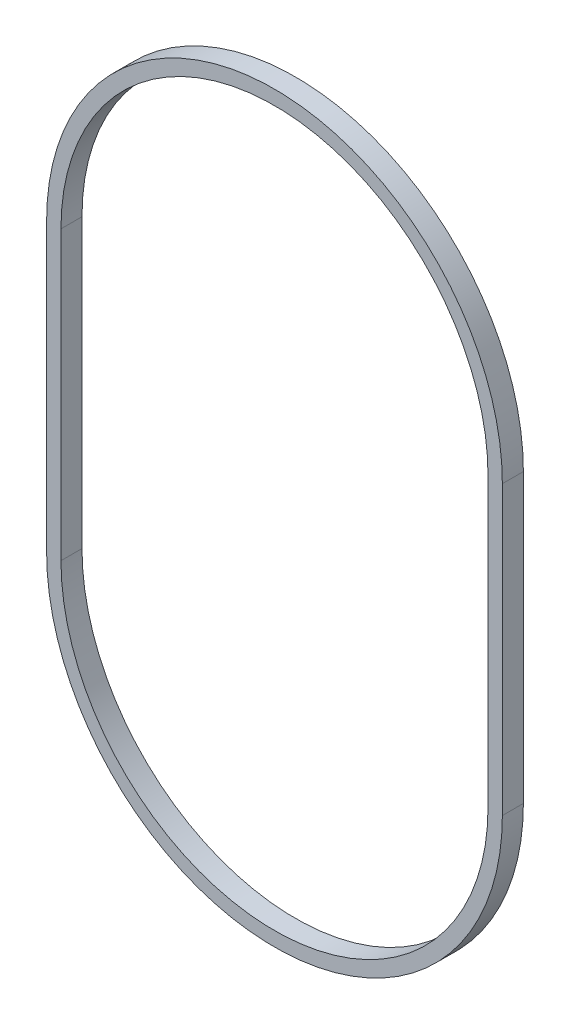
ISO-10303-21;
HEADER;
FILE_DESCRIPTION(('STEP AP214'),'2;1');
FILE_NAME('part.step','',(''),(''),'','','');
FILE_SCHEMA(('AUTOMOTIVE_DESIGN { 1 0 10303 214 1 1 1 1 }'));
ENDSEC;
DATA;
#1=APPLICATION_CONTEXT('core data for automotive mechanical design processes');
#2=APPLICATION_PROTOCOL_DEFINITION('international standard','automotive_design',2000,#1);
#3=PRODUCT_CONTEXT('',#1,'mechanical');
#4=PRODUCT('Part','Part','',(#3));
#5=PRODUCT_RELATED_PRODUCT_CATEGORY('part','',(#4));
#6=PRODUCT_DEFINITION_FORMATION('','',#4);
#7=PRODUCT_DEFINITION_CONTEXT('part definition',#1,'design');
#8=PRODUCT_DEFINITION('design','',#6,#7);
#9=PRODUCT_DEFINITION_SHAPE('','',#8);
#10=(LENGTH_UNIT() NAMED_UNIT(*) SI_UNIT(.MILLI.,.METRE.));
#11=(NAMED_UNIT(*) PLANE_ANGLE_UNIT() SI_UNIT($,.RADIAN.));
#12=(NAMED_UNIT(*) SI_UNIT($,.STERADIAN.) SOLID_ANGLE_UNIT());
#13=UNCERTAINTY_MEASURE_WITH_UNIT(LENGTH_MEASURE(1.E-05),#10,'distance_accuracy_value','');
#14=(GEOMETRIC_REPRESENTATION_CONTEXT(3) GLOBAL_UNCERTAINTY_ASSIGNED_CONTEXT((#13)) GLOBAL_UNIT_ASSIGNED_CONTEXT((#10,
#11,#12)) REPRESENTATION_CONTEXT('',''));
#15=CARTESIAN_POINT('',(0.,0.,0.));
#16=DIRECTION('',(0.,0.,1.));
#17=DIRECTION('',(1.,0.,0.));
#18=AXIS2_PLACEMENT_3D('',#15,#16,#17);
#19=CARTESIAN_POINT('',(0.,-15.04,2.2));
#20=DIRECTION('',(0.,0.,1.));
#21=DIRECTION('',(1.,0.,0.));
#22=AXIS2_PLACEMENT_3D('',#19,#20,#21);
#23=PLANE('',#22);
#24=CARTESIAN_POINT('',(0.,-15.04,2.2));
#25=DIRECTION('',(0.,0.,1.));
#26=DIRECTION('',(1.,0.,0.));
#27=AXIS2_PLACEMENT_3D('',#24,#25,#26);
#28=CIRCLE('',#27,23.85);
#29=CARTESIAN_POINT('',(-23.85,-15.04,2.2));
#30=VERTEX_POINT('',#29);
#31=CARTESIAN_POINT('',(23.85,-15.04,2.2));
#32=VERTEX_POINT('',#31);
#33=EDGE_CURVE('E134',#30,#32,#28,.T.);
#34=ORIENTED_EDGE('',*,*,#33,.T.);
#35=DIRECTION('',(0.,1.,0.));
#36=VECTOR('',#35,1.);
#37=CARTESIAN_POINT('',(23.85,-15.04,2.2));
#38=LINE('',#37,#36);
#39=CARTESIAN_POINT('',(23.85,15.04,2.2));
#40=VERTEX_POINT('',#39);
#41=EDGE_CURVE('E137',#32,#40,#38,.T.);
#42=ORIENTED_EDGE('',*,*,#41,.T.);
#43=CARTESIAN_POINT('',(0.,15.04,2.2));
#44=DIRECTION('',(0.,0.,1.));
#45=DIRECTION('',(1.,0.,0.));
#46=AXIS2_PLACEMENT_3D('',#43,#44,#45);
#47=CIRCLE('',#46,23.85);
#48=CARTESIAN_POINT('',(-23.85,15.04,2.2));
#49=VERTEX_POINT('',#48);
#50=EDGE_CURVE('E140',#40,#49,#47,.T.);
#51=ORIENTED_EDGE('',*,*,#50,.T.);
#52=DIRECTION('',(0.,-1.,0.));
#53=VECTOR('',#52,1.);
#54=CARTESIAN_POINT('',(-23.85,-15.04,2.2));
#55=LINE('',#54,#53);
#56=EDGE_CURVE('E142',#49,#30,#55,.T.);
#57=ORIENTED_EDGE('',*,*,#56,.T.);
#58=EDGE_LOOP('',(#34,#42,#51,#57));
#59=FACE_BOUND('',#58,.T.);
#60=DIRECTION('',(0.,1.,0.));
#61=VECTOR('',#60,1.);
#62=CARTESIAN_POINT('',(22.35,-15.04,2.2));
#63=LINE('',#62,#61);
#64=CARTESIAN_POINT('',(22.35,-15.04,2.2));
#65=VERTEX_POINT('',#64);
#66=CARTESIAN_POINT('',(22.35,15.04,2.2));
#67=VERTEX_POINT('',#66);
#68=EDGE_CURVE('E106',#65,#67,#63,.T.);
#69=ORIENTED_EDGE('',*,*,#68,.F.);
#70=CARTESIAN_POINT('',(0.,-15.04,2.2));
#71=DIRECTION('',(0.,0.,1.));
#72=DIRECTION('',(1.,0.,0.));
#73=AXIS2_PLACEMENT_3D('',#70,#71,#72);
#74=CIRCLE('',#73,22.35);
#75=CARTESIAN_POINT('',(-22.35,-15.04,2.2));
#76=VERTEX_POINT('',#75);
#77=EDGE_CURVE('E98',#76,#65,#74,.T.);
#78=ORIENTED_EDGE('',*,*,#77,.F.);
#79=DIRECTION('',(0.,-1.,0.));
#80=VECTOR('',#79,1.);
#81=CARTESIAN_POINT('',(-22.35,-15.04,2.2));
#82=LINE('',#81,#80);
#83=CARTESIAN_POINT('',(-22.35,15.04,2.2));
#84=VERTEX_POINT('',#83);
#85=EDGE_CURVE('E120',#84,#76,#82,.T.);
#86=ORIENTED_EDGE('',*,*,#85,.F.);
#87=CARTESIAN_POINT('',(0.,15.04,2.2));
#88=DIRECTION('',(0.,0.,1.));
#89=DIRECTION('',(1.,0.,0.));
#90=AXIS2_PLACEMENT_3D('',#87,#88,#89);
#91=CIRCLE('',#90,22.35);
#92=EDGE_CURVE('E118',#67,#84,#91,.T.);
#93=ORIENTED_EDGE('',*,*,#92,.F.);
#94=EDGE_LOOP('',(#69,#78,#86,#93));
#95=FACE_BOUND('',#94,.T.);
#96=ADVANCED_FACE('F33',(#59,#95),#23,.T.);
#97=CARTESIAN_POINT('',(0.,-15.04,0.));
#98=DIRECTION('',(0.,0.,1.));
#99=DIRECTION('',(1.,0.,0.));
#100=AXIS2_PLACEMENT_3D('',#97,#98,#99);
#101=PLANE('',#100);
#102=CARTESIAN_POINT('',(0.,-15.04,0.));
#103=DIRECTION('',(0.,0.,1.));
#104=DIRECTION('',(1.,0.,0.));
#105=AXIS2_PLACEMENT_3D('',#102,#103,#104);
#106=CIRCLE('',#105,23.85);
#107=CARTESIAN_POINT('',(-23.85,-15.04,0.));
#108=VERTEX_POINT('',#107);
#109=CARTESIAN_POINT('',(23.85,-15.04,0.));
#110=VERTEX_POINT('',#109);
#111=EDGE_CURVE('E114',#108,#110,#106,.T.);
#112=ORIENTED_EDGE('',*,*,#111,.F.);
#113=DIRECTION('',(0.,-1.,0.));
#114=VECTOR('',#113,1.);
#115=CARTESIAN_POINT('',(-23.85,-15.04,0.));
#116=LINE('',#115,#114);
#117=CARTESIAN_POINT('',(-23.85,15.04,0.));
#118=VERTEX_POINT('',#117);
#119=EDGE_CURVE('E138',#118,#108,#116,.T.);
#120=ORIENTED_EDGE('',*,*,#119,.F.);
#121=CARTESIAN_POINT('',(0.,15.04,0.));
#122=DIRECTION('',(0.,0.,1.));
#123=DIRECTION('',(1.,0.,0.));
#124=AXIS2_PLACEMENT_3D('',#121,#122,#123);
#125=CIRCLE('',#124,23.85);
#126=CARTESIAN_POINT('',(23.85,15.04,0.));
#127=VERTEX_POINT('',#126);
#128=EDGE_CURVE('E149',#127,#118,#125,.T.);
#129=ORIENTED_EDGE('',*,*,#128,.F.);
#130=DIRECTION('',(0.,1.,0.));
#131=VECTOR('',#130,1.);
#132=CARTESIAN_POINT('',(23.85,-15.04,0.));
#133=LINE('',#132,#131);
#134=EDGE_CURVE('E147',#110,#127,#133,.T.);
#135=ORIENTED_EDGE('',*,*,#134,.F.);
#136=EDGE_LOOP('',(#112,#120,#129,#135));
#137=FACE_BOUND('',#136,.T.);
#138=CARTESIAN_POINT('',(0.,-15.04,0.));
#139=DIRECTION('',(0.,0.,1.));
#140=DIRECTION('',(1.,0.,0.));
#141=AXIS2_PLACEMENT_3D('',#138,#139,#140);
#142=CIRCLE('',#141,22.35);
#143=CARTESIAN_POINT('',(-22.35,-15.04,0.));
#144=VERTEX_POINT('',#143);
#145=CARTESIAN_POINT('',(22.35,-15.04,0.));
#146=VERTEX_POINT('',#145);
#147=EDGE_CURVE('E56',#144,#146,#142,.T.);
#148=ORIENTED_EDGE('',*,*,#147,.T.);
#149=DIRECTION('',(0.,1.,0.));
#150=VECTOR('',#149,1.);
#151=CARTESIAN_POINT('',(22.35,-15.04,0.));
#152=LINE('',#151,#150);
#153=CARTESIAN_POINT('',(22.35,15.04,0.));
#154=VERTEX_POINT('',#153);
#155=EDGE_CURVE('E113',#146,#154,#152,.T.);
#156=ORIENTED_EDGE('',*,*,#155,.T.);
#157=CARTESIAN_POINT('',(0.,15.04,0.));
#158=DIRECTION('',(0.,0.,1.));
#159=DIRECTION('',(1.,0.,0.));
#160=AXIS2_PLACEMENT_3D('',#157,#158,#159);
#161=CIRCLE('',#160,22.35);
#162=CARTESIAN_POINT('',(-22.35,15.04,0.));
#163=VERTEX_POINT('',#162);
#164=EDGE_CURVE('E126',#154,#163,#161,.T.);
#165=ORIENTED_EDGE('',*,*,#164,.T.);
#166=DIRECTION('',(0.,-1.,0.));
#167=VECTOR('',#166,1.);
#168=CARTESIAN_POINT('',(-22.35,-15.04,0.));
#169=LINE('',#168,#167);
#170=EDGE_CURVE('E107',#163,#144,#169,.T.);
#171=ORIENTED_EDGE('',*,*,#170,.T.);
#172=EDGE_LOOP('',(#148,#156,#165,#171));
#173=FACE_BOUND('',#172,.T.);
#174=ADVANCED_FACE('F167',(#137,#173),#101,.F.);
#175=CARTESIAN_POINT('',(0.,-15.04,2.2));
#176=DIRECTION('',(0.,0.,-1.));
#177=DIRECTION('',(-1.,0.,0.));
#178=AXIS2_PLACEMENT_3D('',#175,#176,#177);
#179=CYLINDRICAL_SURFACE('',#178,23.85);
#180=ORIENTED_EDGE('',*,*,#111,.T.);
#181=DIRECTION('',(0.,0.,-1.));
#182=VECTOR('',#181,1.);
#183=CARTESIAN_POINT('',(23.85,-15.04,2.2));
#184=LINE('',#183,#182);
#185=EDGE_CURVE('E11',#32,#110,#184,.T.);
#186=ORIENTED_EDGE('',*,*,#185,.F.);
#187=ORIENTED_EDGE('',*,*,#33,.F.);
#188=DIRECTION('',(0.,0.,-1.));
#189=VECTOR('',#188,1.);
#190=CARTESIAN_POINT('',(-23.85,-15.04,2.2));
#191=LINE('',#190,#189);
#192=EDGE_CURVE('E144',#30,#108,#191,.T.);
#193=ORIENTED_EDGE('',*,*,#192,.T.);
#194=EDGE_LOOP('',(#180,#186,#187,#193));
#195=FACE_BOUND('',#194,.T.);
#196=ADVANCED_FACE('F35',(#195),#179,.T.);
#197=CARTESIAN_POINT('',(23.85,-15.04,2.2));
#198=DIRECTION('',(-1.,0.,0.));
#199=DIRECTION('',(0.,0.,1.));
#200=AXIS2_PLACEMENT_3D('',#197,#198,#199);
#201=PLANE('',#200);
#202=ORIENTED_EDGE('',*,*,#134,.T.);
#203=DIRECTION('',(0.,0.,-1.));
#204=VECTOR('',#203,1.);
#205=CARTESIAN_POINT('',(23.85,15.04,2.2));
#206=LINE('',#205,#204);
#207=EDGE_CURVE('E41',#40,#127,#206,.T.);
#208=ORIENTED_EDGE('',*,*,#207,.F.);
#209=ORIENTED_EDGE('',*,*,#41,.F.);
#210=ORIENTED_EDGE('',*,*,#185,.T.);
#211=EDGE_LOOP('',(#202,#208,#209,#210));
#212=FACE_BOUND('',#211,.T.);
#213=ADVANCED_FACE('F177',(#212),#201,.F.);
#214=CARTESIAN_POINT('',(0.,15.04,2.2));
#215=DIRECTION('',(0.,0.,-1.));
#216=DIRECTION('',(-1.,0.,0.));
#217=AXIS2_PLACEMENT_3D('',#214,#215,#216);
#218=CYLINDRICAL_SURFACE('',#217,23.85);
#219=ORIENTED_EDGE('',*,*,#128,.T.);
#220=DIRECTION('',(0.,0.,-1.));
#221=VECTOR('',#220,1.);
#222=CARTESIAN_POINT('',(-23.85,15.04,2.2));
#223=LINE('',#222,#221);
#224=EDGE_CURVE('E154',#49,#118,#223,.T.);
#225=ORIENTED_EDGE('',*,*,#224,.F.);
#226=ORIENTED_EDGE('',*,*,#50,.F.);
#227=ORIENTED_EDGE('',*,*,#207,.T.);
#228=EDGE_LOOP('',(#219,#225,#226,#227));
#229=FACE_BOUND('',#228,.T.);
#230=ADVANCED_FACE('F161',(#229),#218,.T.);
#231=CARTESIAN_POINT('',(-23.85,-15.04,2.2));
#232=DIRECTION('',(1.,0.,0.));
#233=DIRECTION('',(0.,0.,-1.));
#234=AXIS2_PLACEMENT_3D('',#231,#232,#233);
#235=PLANE('',#234);
#236=ORIENTED_EDGE('',*,*,#119,.T.);
#237=ORIENTED_EDGE('',*,*,#192,.F.);
#238=ORIENTED_EDGE('',*,*,#56,.F.);
#239=ORIENTED_EDGE('',*,*,#224,.T.);
#240=EDGE_LOOP('',(#236,#237,#238,#239));
#241=FACE_BOUND('',#240,.T.);
#242=ADVANCED_FACE('F171',(#241),#235,.F.);
#243=CARTESIAN_POINT('',(0.,-15.04,2.2));
#244=DIRECTION('',(0.,0.,-1.));
#245=DIRECTION('',(-1.,0.,0.));
#246=AXIS2_PLACEMENT_3D('',#243,#244,#245);
#247=CYLINDRICAL_SURFACE('',#246,22.35);
#248=ORIENTED_EDGE('',*,*,#147,.F.);
#249=DIRECTION('',(0.,0.,-1.));
#250=VECTOR('',#249,1.);
#251=CARTESIAN_POINT('',(-22.35,-15.04,2.2));
#252=LINE('',#251,#250);
#253=EDGE_CURVE('E102',#76,#144,#252,.T.);
#254=ORIENTED_EDGE('',*,*,#253,.F.);
#255=ORIENTED_EDGE('',*,*,#77,.T.);
#256=DIRECTION('',(0.,0.,-1.));
#257=VECTOR('',#256,1.);
#258=CARTESIAN_POINT('',(22.35,-15.04,2.2));
#259=LINE('',#258,#257);
#260=EDGE_CURVE('E101',#65,#146,#259,.T.);
#261=ORIENTED_EDGE('',*,*,#260,.T.);
#262=EDGE_LOOP('',(#248,#254,#255,#261));
#263=FACE_BOUND('',#262,.T.);
#264=ADVANCED_FACE('F100',(#263),#247,.F.);
#265=CARTESIAN_POINT('',(22.35,-15.04,2.2));
#266=DIRECTION('',(-1.,0.,0.));
#267=DIRECTION('',(0.,-1.,0.));
#268=AXIS2_PLACEMENT_3D('',#265,#266,#267);
#269=PLANE('',#268);
#270=ORIENTED_EDGE('',*,*,#155,.F.);
#271=ORIENTED_EDGE('',*,*,#260,.F.);
#272=ORIENTED_EDGE('',*,*,#68,.T.);
#273=DIRECTION('',(0.,0.,-1.));
#274=VECTOR('',#273,1.);
#275=CARTESIAN_POINT('',(22.35,15.04,2.2));
#276=LINE('',#275,#274);
#277=EDGE_CURVE('E115',#67,#154,#276,.T.);
#278=ORIENTED_EDGE('',*,*,#277,.T.);
#279=EDGE_LOOP('',(#270,#271,#272,#278));
#280=FACE_BOUND('',#279,.T.);
#281=ADVANCED_FACE('F110',(#280),#269,.T.);
#282=CARTESIAN_POINT('',(0.,15.04,2.2));
#283=DIRECTION('',(0.,0.,-1.));
#284=DIRECTION('',(-1.,0.,0.));
#285=AXIS2_PLACEMENT_3D('',#282,#283,#284);
#286=CYLINDRICAL_SURFACE('',#285,22.35);
#287=ORIENTED_EDGE('',*,*,#164,.F.);
#288=ORIENTED_EDGE('',*,*,#277,.F.);
#289=ORIENTED_EDGE('',*,*,#92,.T.);
#290=DIRECTION('',(0.,0.,-1.));
#291=VECTOR('',#290,1.);
#292=CARTESIAN_POINT('',(-22.35,15.04,2.2));
#293=LINE('',#292,#291);
#294=EDGE_CURVE('E48',#84,#163,#293,.T.);
#295=ORIENTED_EDGE('',*,*,#294,.T.);
#296=EDGE_LOOP('',(#287,#288,#289,#295));
#297=FACE_BOUND('',#296,.T.);
#298=ADVANCED_FACE('F200',(#297),#286,.F.);
#299=CARTESIAN_POINT('',(-22.35,-15.04,2.2));
#300=DIRECTION('',(1.,0.,0.));
#301=DIRECTION('',(0.,1.,0.));
#302=AXIS2_PLACEMENT_3D('',#299,#300,#301);
#303=PLANE('',#302);
#304=ORIENTED_EDGE('',*,*,#170,.F.);
#305=ORIENTED_EDGE('',*,*,#294,.F.);
#306=ORIENTED_EDGE('',*,*,#85,.T.);
#307=ORIENTED_EDGE('',*,*,#253,.T.);
#308=EDGE_LOOP('',(#304,#305,#306,#307));
#309=FACE_BOUND('',#308,.T.);
#310=ADVANCED_FACE('F204',(#309),#303,.T.);
#311=CLOSED_SHELL('',(#96,#174,#196,#213,#230,#242,#264,#281,#298,#310));
#312=MANIFOLD_SOLID_BREP('B2',#311);
#313=ADVANCED_BREP_SHAPE_REPRESENTATION('',(#18,#312),#14);
#314=SHAPE_DEFINITION_REPRESENTATION(#9,#313);
ENDSEC;
END-ISO-10303-21;
